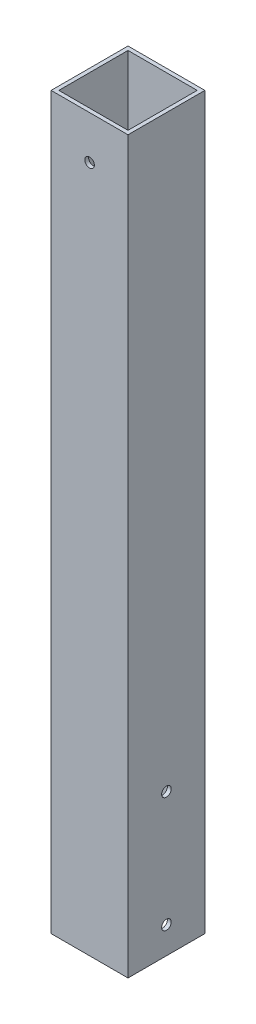
ISO-10303-21;
HEADER;
FILE_DESCRIPTION(('STEP AP214'),'2;1');
FILE_NAME('part.step','',(''),(''),'','','');
FILE_SCHEMA(('AUTOMOTIVE_DESIGN { 1 0 10303 214 1 1 1 1 }'));
ENDSEC;
DATA;
#1=APPLICATION_CONTEXT('core data for automotive mechanical design processes');
#2=APPLICATION_PROTOCOL_DEFINITION('international standard','automotive_design',2000,#1);
#3=PRODUCT_CONTEXT('',#1,'mechanical');
#4=PRODUCT('Part','Part','',(#3));
#5=PRODUCT_RELATED_PRODUCT_CATEGORY('part','',(#4));
#6=PRODUCT_DEFINITION_FORMATION('','',#4);
#7=PRODUCT_DEFINITION_CONTEXT('part definition',#1,'design');
#8=PRODUCT_DEFINITION('design','',#6,#7);
#9=PRODUCT_DEFINITION_SHAPE('','',#8);
#10=(LENGTH_UNIT() NAMED_UNIT(*) SI_UNIT(.MILLI.,.METRE.));
#11=(NAMED_UNIT(*) PLANE_ANGLE_UNIT() SI_UNIT($,.RADIAN.));
#12=(NAMED_UNIT(*) SI_UNIT($,.STERADIAN.) SOLID_ANGLE_UNIT());
#13=UNCERTAINTY_MEASURE_WITH_UNIT(LENGTH_MEASURE(1.E-05),#10,'distance_accuracy_value','');
#14=(GEOMETRIC_REPRESENTATION_CONTEXT(3) GLOBAL_UNCERTAINTY_ASSIGNED_CONTEXT((#13)) GLOBAL_UNIT_ASSIGNED_CONTEXT((#10,
#11,#12)) REPRESENTATION_CONTEXT('',''));
#15=CARTESIAN_POINT('',(0.,0.,0.));
#16=DIRECTION('',(0.,0.,1.));
#17=DIRECTION('',(1.,0.,0.));
#18=AXIS2_PLACEMENT_3D('',#15,#16,#17);
#19=CARTESIAN_POINT('',(0.,380.,0.));
#20=DIRECTION('',(0.,1.,0.));
#21=DIRECTION('',(0.,0.,1.));
#22=AXIS2_PLACEMENT_3D('',#19,#20,#21);
#23=PLANE('',#22);
#24=DIRECTION('',(0.,0.,-1.));
#25=VECTOR('',#24,1.);
#26=CARTESIAN_POINT('',(0.,380.,0.));
#27=LINE('',#26,#25);
#28=CARTESIAN_POINT('',(0.,380.,0.));
#29=VERTEX_POINT('',#28);
#30=CARTESIAN_POINT('',(0.,380.,-40.));
#31=VERTEX_POINT('',#30);
#32=EDGE_CURVE('E168',#29,#31,#27,.T.);
#33=ORIENTED_EDGE('',*,*,#32,.T.);
#34=DIRECTION('',(-1.,0.,0.));
#35=VECTOR('',#34,1.);
#36=CARTESIAN_POINT('',(0.,380.,-40.));
#37=LINE('',#36,#35);
#38=CARTESIAN_POINT('',(-40.,380.,-40.));
#39=VERTEX_POINT('',#38);
#40=EDGE_CURVE('E171',#31,#39,#37,.T.);
#41=ORIENTED_EDGE('',*,*,#40,.T.);
#42=DIRECTION('',(0.,0.,1.));
#43=VECTOR('',#42,1.);
#44=CARTESIAN_POINT('',(-40.,380.,0.));
#45=LINE('',#44,#43);
#46=CARTESIAN_POINT('',(-40.,380.,0.));
#47=VERTEX_POINT('',#46);
#48=EDGE_CURVE('E174',#39,#47,#45,.T.);
#49=ORIENTED_EDGE('',*,*,#48,.T.);
#50=DIRECTION('',(1.,0.,0.));
#51=VECTOR('',#50,1.);
#52=CARTESIAN_POINT('',(0.,380.,0.));
#53=LINE('',#52,#51);
#54=EDGE_CURVE('E176',#47,#29,#53,.T.);
#55=ORIENTED_EDGE('',*,*,#54,.T.);
#56=EDGE_LOOP('',(#33,#41,#49,#55));
#57=FACE_BOUND('',#56,.T.);
#58=DIRECTION('',(-1.,0.,0.));
#59=VECTOR('',#58,1.);
#60=CARTESIAN_POINT('',(0.,380.,-38.));
#61=LINE('',#60,#59);
#62=CARTESIAN_POINT('',(-2.,380.,-38.));
#63=VERTEX_POINT('',#62);
#64=CARTESIAN_POINT('',(-38.,380.,-38.));
#65=VERTEX_POINT('',#64);
#66=EDGE_CURVE('E138',#63,#65,#61,.T.);
#67=ORIENTED_EDGE('',*,*,#66,.F.);
#68=DIRECTION('',(0.,0.,-1.));
#69=VECTOR('',#68,1.);
#70=CARTESIAN_POINT('',(-2.,380.,0.));
#71=LINE('',#70,#69);
#72=CARTESIAN_POINT('',(-2.,380.,-2.));
#73=VERTEX_POINT('',#72);
#74=EDGE_CURVE('E130',#73,#63,#71,.T.);
#75=ORIENTED_EDGE('',*,*,#74,.F.);
#76=DIRECTION('',(1.,0.,0.));
#77=VECTOR('',#76,1.);
#78=CARTESIAN_POINT('',(0.,380.,-2.));
#79=LINE('',#78,#77);
#80=CARTESIAN_POINT('',(-38.,380.,-2.));
#81=VERTEX_POINT('',#80);
#82=EDGE_CURVE('E152',#81,#73,#79,.T.);
#83=ORIENTED_EDGE('',*,*,#82,.F.);
#84=DIRECTION('',(0.,0.,1.));
#85=VECTOR('',#84,1.);
#86=CARTESIAN_POINT('',(-38.,380.,0.));
#87=LINE('',#86,#85);
#88=EDGE_CURVE('E150',#65,#81,#87,.T.);
#89=ORIENTED_EDGE('',*,*,#88,.F.);
#90=EDGE_LOOP('',(#67,#75,#83,#89));
#91=FACE_BOUND('',#90,.T.);
#92=ADVANCED_FACE('F63',(#57,#91),#23,.T.);
#93=CARTESIAN_POINT('',(0.,0.,0.));
#94=DIRECTION('',(0.,1.,0.));
#95=DIRECTION('',(0.,0.,1.));
#96=AXIS2_PLACEMENT_3D('',#93,#94,#95);
#97=PLANE('',#96);
#98=DIRECTION('',(0.,0.,-1.));
#99=VECTOR('',#98,1.);
#100=CARTESIAN_POINT('',(0.,0.,0.));
#101=LINE('',#100,#99);
#102=CARTESIAN_POINT('',(0.,0.,0.));
#103=VERTEX_POINT('',#102);
#104=CARTESIAN_POINT('',(0.,0.,-40.));
#105=VERTEX_POINT('',#104);
#106=EDGE_CURVE('E146',#103,#105,#101,.T.);
#107=ORIENTED_EDGE('',*,*,#106,.F.);
#108=DIRECTION('',(1.,0.,0.));
#109=VECTOR('',#108,1.);
#110=CARTESIAN_POINT('',(0.,0.,0.));
#111=LINE('',#110,#109);
#112=CARTESIAN_POINT('',(-40.,0.,0.));
#113=VERTEX_POINT('',#112);
#114=EDGE_CURVE('E172',#113,#103,#111,.T.);
#115=ORIENTED_EDGE('',*,*,#114,.F.);
#116=DIRECTION('',(0.,0.,1.));
#117=VECTOR('',#116,1.);
#118=CARTESIAN_POINT('',(-40.,0.,0.));
#119=LINE('',#118,#117);
#120=CARTESIAN_POINT('',(-40.,0.,-40.));
#121=VERTEX_POINT('',#120);
#122=EDGE_CURVE('E183',#121,#113,#119,.T.);
#123=ORIENTED_EDGE('',*,*,#122,.F.);
#124=DIRECTION('',(-1.,0.,0.));
#125=VECTOR('',#124,1.);
#126=CARTESIAN_POINT('',(0.,0.,-40.));
#127=LINE('',#126,#125);
#128=EDGE_CURVE('E181',#105,#121,#127,.T.);
#129=ORIENTED_EDGE('',*,*,#128,.F.);
#130=EDGE_LOOP('',(#107,#115,#123,#129));
#131=FACE_BOUND('',#130,.T.);
#132=DIRECTION('',(0.,0.,-1.));
#133=VECTOR('',#132,1.);
#134=CARTESIAN_POINT('',(-2.,0.,0.));
#135=LINE('',#134,#133);
#136=CARTESIAN_POINT('',(-2.,0.,-2.));
#137=VERTEX_POINT('',#136);
#138=CARTESIAN_POINT('',(-2.,0.,-38.));
#139=VERTEX_POINT('',#138);
#140=EDGE_CURVE('E88',#137,#139,#135,.T.);
#141=ORIENTED_EDGE('',*,*,#140,.T.);
#142=DIRECTION('',(-1.,0.,0.));
#143=VECTOR('',#142,1.);
#144=CARTESIAN_POINT('',(0.,0.,-38.));
#145=LINE('',#144,#143);
#146=CARTESIAN_POINT('',(-38.,0.,-38.));
#147=VERTEX_POINT('',#146);
#148=EDGE_CURVE('E145',#139,#147,#145,.T.);
#149=ORIENTED_EDGE('',*,*,#148,.T.);
#150=DIRECTION('',(0.,0.,1.));
#151=VECTOR('',#150,1.);
#152=CARTESIAN_POINT('',(-38.,0.,0.));
#153=LINE('',#152,#151);
#154=CARTESIAN_POINT('',(-38.,0.,-2.));
#155=VERTEX_POINT('',#154);
#156=EDGE_CURVE('E160',#147,#155,#153,.T.);
#157=ORIENTED_EDGE('',*,*,#156,.T.);
#158=DIRECTION('',(1.,0.,0.));
#159=VECTOR('',#158,1.);
#160=CARTESIAN_POINT('',(0.,0.,-2.));
#161=LINE('',#160,#159);
#162=EDGE_CURVE('E139',#155,#137,#161,.T.);
#163=ORIENTED_EDGE('',*,*,#162,.T.);
#164=EDGE_LOOP('',(#141,#149,#157,#163));
#165=FACE_BOUND('',#164,.T.);
#166=ADVANCED_FACE('F249',(#131,#165),#97,.F.);
#167=CARTESIAN_POINT('',(0.,380.,0.));
#168=DIRECTION('',(-1.,0.,0.));
#169=DIRECTION('',(0.,0.,1.));
#170=AXIS2_PLACEMENT_3D('',#167,#168,#169);
#171=PLANE('',#170);
#172=CARTESIAN_POINT('',(0.,14.,-20.));
#173=DIRECTION('',(-1.,0.,0.));
#174=DIRECTION('',(0.,0.,1.));
#175=AXIS2_PLACEMENT_3D('',#172,#173,#174);
#176=CIRCLE('',#175,2.5);
#177=CARTESIAN_POINT('',(0.,14.,-17.5));
#178=VERTEX_POINT('',#177);
#179=EDGE_CURVE('E219',#178,#178,#176,.T.);
#180=ORIENTED_EDGE('',*,*,#179,.T.);
#181=EDGE_LOOP('',(#180));
#182=FACE_BOUND('',#181,.T.);
#183=CARTESIAN_POINT('',(0.,74.,-20.));
#184=DIRECTION('',(-1.,0.,0.));
#185=DIRECTION('',(0.,0.,1.));
#186=AXIS2_PLACEMENT_3D('',#183,#184,#185);
#187=CIRCLE('',#186,2.5);
#188=CARTESIAN_POINT('',(0.,74.,-17.5));
#189=VERTEX_POINT('',#188);
#190=EDGE_CURVE('E204',#189,#189,#187,.T.);
#191=ORIENTED_EDGE('',*,*,#190,.T.);
#192=EDGE_LOOP('',(#191));
#193=FACE_BOUND('',#192,.T.);
#194=ORIENTED_EDGE('',*,*,#106,.T.);
#195=DIRECTION('',(0.,-1.,0.));
#196=VECTOR('',#195,1.);
#197=CARTESIAN_POINT('',(0.,380.,-40.));
#198=LINE('',#197,#196);
#199=EDGE_CURVE('E12',#31,#105,#198,.T.);
#200=ORIENTED_EDGE('',*,*,#199,.F.);
#201=ORIENTED_EDGE('',*,*,#32,.F.);
#202=DIRECTION('',(0.,-1.,0.));
#203=VECTOR('',#202,1.);
#204=CARTESIAN_POINT('',(0.,380.,0.));
#205=LINE('',#204,#203);
#206=EDGE_CURVE('E178',#29,#103,#205,.T.);
#207=ORIENTED_EDGE('',*,*,#206,.T.);
#208=EDGE_LOOP('',(#194,#200,#201,#207));
#209=FACE_BOUND('',#208,.T.);
#210=ADVANCED_FACE('F65',(#182,#193,#209),#171,.F.);
#211=CARTESIAN_POINT('',(0.,380.,-40.));
#212=DIRECTION('',(0.,0.,1.));
#213=DIRECTION('',(1.,0.,0.));
#214=AXIS2_PLACEMENT_3D('',#211,#212,#213);
#215=PLANE('',#214);
#216=CARTESIAN_POINT('',(-20.,357.5,-40.));
#217=DIRECTION('',(0.,0.,1.));
#218=DIRECTION('',(1.,0.,0.));
#219=AXIS2_PLACEMENT_3D('',#216,#217,#218);
#220=CIRCLE('',#219,2.49999999999998);
#221=CARTESIAN_POINT('',(-17.5,357.5,-40.));
#222=VERTEX_POINT('',#221);
#223=EDGE_CURVE('E158',#222,#222,#220,.T.);
#224=ORIENTED_EDGE('',*,*,#223,.T.);
#225=EDGE_LOOP('',(#224));
#226=FACE_BOUND('',#225,.T.);
#227=ORIENTED_EDGE('',*,*,#128,.T.);
#228=DIRECTION('',(0.,-1.,0.));
#229=VECTOR('',#228,1.);
#230=CARTESIAN_POINT('',(-40.,380.,-40.));
#231=LINE('',#230,#229);
#232=EDGE_CURVE('E72',#39,#121,#231,.T.);
#233=ORIENTED_EDGE('',*,*,#232,.F.);
#234=ORIENTED_EDGE('',*,*,#40,.F.);
#235=ORIENTED_EDGE('',*,*,#199,.T.);
#236=EDGE_LOOP('',(#227,#233,#234,#235));
#237=FACE_BOUND('',#236,.T.);
#238=ADVANCED_FACE('F228',(#226,#237),#215,.F.);
#239=CARTESIAN_POINT('',(-40.,380.,0.));
#240=DIRECTION('',(1.,0.,0.));
#241=DIRECTION('',(0.,0.,-1.));
#242=AXIS2_PLACEMENT_3D('',#239,#240,#241);
#243=PLANE('',#242);
#244=CARTESIAN_POINT('',(-40.,14.,-20.));
#245=DIRECTION('',(-1.,0.,0.));
#246=DIRECTION('',(0.,0.,1.));
#247=AXIS2_PLACEMENT_3D('',#244,#245,#246);
#248=CIRCLE('',#247,2.5);
#249=CARTESIAN_POINT('',(-40.,14.,-17.5));
#250=VERTEX_POINT('',#249);
#251=EDGE_CURVE('E200',#250,#250,#248,.T.);
#252=ORIENTED_EDGE('',*,*,#251,.F.);
#253=EDGE_LOOP('',(#252));
#254=FACE_BOUND('',#253,.T.);
#255=CARTESIAN_POINT('',(-40.,74.,-20.));
#256=DIRECTION('',(-1.,0.,0.));
#257=DIRECTION('',(0.,0.,1.));
#258=AXIS2_PLACEMENT_3D('',#255,#256,#257);
#259=CIRCLE('',#258,2.5);
#260=CARTESIAN_POINT('',(-40.,74.,-17.5));
#261=VERTEX_POINT('',#260);
#262=EDGE_CURVE('E207',#261,#261,#259,.T.);
#263=ORIENTED_EDGE('',*,*,#262,.F.);
#264=EDGE_LOOP('',(#263));
#265=FACE_BOUND('',#264,.T.);
#266=ORIENTED_EDGE('',*,*,#122,.T.);
#267=DIRECTION('',(0.,-1.,0.));
#268=VECTOR('',#267,1.);
#269=CARTESIAN_POINT('',(-40.,380.,0.));
#270=LINE('',#269,#268);
#271=EDGE_CURVE('E188',#47,#113,#270,.T.);
#272=ORIENTED_EDGE('',*,*,#271,.F.);
#273=ORIENTED_EDGE('',*,*,#48,.F.);
#274=ORIENTED_EDGE('',*,*,#232,.T.);
#275=EDGE_LOOP('',(#266,#272,#273,#274));
#276=FACE_BOUND('',#275,.T.);
#277=ADVANCED_FACE('F263',(#254,#265,#276),#243,.F.);
#278=CARTESIAN_POINT('',(0.,380.,0.));
#279=DIRECTION('',(0.,0.,-1.));
#280=DIRECTION('',(-1.,0.,0.));
#281=AXIS2_PLACEMENT_3D('',#278,#279,#280);
#282=PLANE('',#281);
#283=CARTESIAN_POINT('',(-20.,357.5,0.));
#284=DIRECTION('',(0.,0.,1.));
#285=DIRECTION('',(1.,0.,0.));
#286=AXIS2_PLACEMENT_3D('',#283,#284,#285);
#287=CIRCLE('',#286,2.49999999999998);
#288=CARTESIAN_POINT('',(-17.5,357.5,0.));
#289=VERTEX_POINT('',#288);
#290=EDGE_CURVE('E196',#289,#289,#287,.T.);
#291=ORIENTED_EDGE('',*,*,#290,.F.);
#292=EDGE_LOOP('',(#291));
#293=FACE_BOUND('',#292,.T.);
#294=ORIENTED_EDGE('',*,*,#114,.T.);
#295=ORIENTED_EDGE('',*,*,#206,.F.);
#296=ORIENTED_EDGE('',*,*,#54,.F.);
#297=ORIENTED_EDGE('',*,*,#271,.T.);
#298=EDGE_LOOP('',(#294,#295,#296,#297));
#299=FACE_BOUND('',#298,.T.);
#300=ADVANCED_FACE('F260',(#293,#299),#282,.F.);
#301=CARTESIAN_POINT('',(-2.,380.,0.));
#302=DIRECTION('',(-1.,0.,0.));
#303=DIRECTION('',(0.,0.,1.));
#304=AXIS2_PLACEMENT_3D('',#301,#302,#303);
#305=PLANE('',#304);
#306=CARTESIAN_POINT('',(-2.,14.,-20.));
#307=DIRECTION('',(-1.,0.,0.));
#308=DIRECTION('',(0.,0.,1.));
#309=AXIS2_PLACEMENT_3D('',#306,#307,#308);
#310=CIRCLE('',#309,2.5);
#311=CARTESIAN_POINT('',(-2.,14.,-17.5));
#312=VERTEX_POINT('',#311);
#313=EDGE_CURVE('E216',#312,#312,#310,.T.);
#314=ORIENTED_EDGE('',*,*,#313,.F.);
#315=EDGE_LOOP('',(#314));
#316=FACE_BOUND('',#315,.T.);
#317=CARTESIAN_POINT('',(-2.,74.,-20.));
#318=DIRECTION('',(-1.,0.,0.));
#319=DIRECTION('',(0.,0.,1.));
#320=AXIS2_PLACEMENT_3D('',#317,#318,#319);
#321=CIRCLE('',#320,2.5);
#322=CARTESIAN_POINT('',(-2.,74.,-17.5));
#323=VERTEX_POINT('',#322);
#324=EDGE_CURVE('E199',#323,#323,#321,.T.);
#325=ORIENTED_EDGE('',*,*,#324,.F.);
#326=EDGE_LOOP('',(#325));
#327=FACE_BOUND('',#326,.T.);
#328=ORIENTED_EDGE('',*,*,#140,.F.);
#329=DIRECTION('',(0.,-1.,0.));
#330=VECTOR('',#329,1.);
#331=CARTESIAN_POINT('',(-2.,380.,-2.));
#332=LINE('',#331,#330);
#333=EDGE_CURVE('E134',#73,#137,#332,.T.);
#334=ORIENTED_EDGE('',*,*,#333,.F.);
#335=ORIENTED_EDGE('',*,*,#74,.T.);
#336=DIRECTION('',(0.,-1.,0.));
#337=VECTOR('',#336,1.);
#338=CARTESIAN_POINT('',(-2.,380.,-38.));
#339=LINE('',#338,#337);
#340=EDGE_CURVE('E133',#63,#139,#339,.T.);
#341=ORIENTED_EDGE('',*,*,#340,.T.);
#342=EDGE_LOOP('',(#328,#334,#335,#341));
#343=FACE_BOUND('',#342,.T.);
#344=ADVANCED_FACE('F132',(#316,#327,#343),#305,.T.);
#345=CARTESIAN_POINT('',(0.,380.,-38.));
#346=DIRECTION('',(0.,0.,1.));
#347=DIRECTION('',(1.,0.,0.));
#348=AXIS2_PLACEMENT_3D('',#345,#346,#347);
#349=PLANE('',#348);
#350=CARTESIAN_POINT('',(-20.,357.5,-38.));
#351=DIRECTION('',(0.,0.,1.));
#352=DIRECTION('',(1.,0.,0.));
#353=AXIS2_PLACEMENT_3D('',#350,#351,#352);
#354=CIRCLE('',#353,2.49999999999998);
#355=CARTESIAN_POINT('',(-17.5,357.5,-38.));
#356=VERTEX_POINT('',#355);
#357=EDGE_CURVE('E195',#356,#356,#354,.T.);
#358=ORIENTED_EDGE('',*,*,#357,.F.);
#359=EDGE_LOOP('',(#358));
#360=FACE_BOUND('',#359,.T.);
#361=ORIENTED_EDGE('',*,*,#148,.F.);
#362=ORIENTED_EDGE('',*,*,#340,.F.);
#363=ORIENTED_EDGE('',*,*,#66,.T.);
#364=DIRECTION('',(0.,-1.,0.));
#365=VECTOR('',#364,1.);
#366=CARTESIAN_POINT('',(-38.,380.,-38.));
#367=LINE('',#366,#365);
#368=EDGE_CURVE('E147',#65,#147,#367,.T.);
#369=ORIENTED_EDGE('',*,*,#368,.T.);
#370=EDGE_LOOP('',(#361,#362,#363,#369));
#371=FACE_BOUND('',#370,.T.);
#372=ADVANCED_FACE('F142',(#360,#371),#349,.T.);
#373=CARTESIAN_POINT('',(-38.,380.,0.));
#374=DIRECTION('',(1.,0.,0.));
#375=DIRECTION('',(0.,0.,-1.));
#376=AXIS2_PLACEMENT_3D('',#373,#374,#375);
#377=PLANE('',#376);
#378=CARTESIAN_POINT('',(-38.,14.,-20.));
#379=DIRECTION('',(1.,0.,0.));
#380=DIRECTION('',(0.,0.,-1.));
#381=AXIS2_PLACEMENT_3D('',#378,#379,#380);
#382=CIRCLE('',#381,2.5);
#383=CARTESIAN_POINT('',(-38.,14.,-22.5));
#384=VERTEX_POINT('',#383);
#385=EDGE_CURVE('E67',#384,#384,#382,.T.);
#386=ORIENTED_EDGE('',*,*,#385,.F.);
#387=EDGE_LOOP('',(#386));
#388=FACE_BOUND('',#387,.T.);
#389=CARTESIAN_POINT('',(-38.,74.,-20.));
#390=DIRECTION('',(1.,0.,0.));
#391=DIRECTION('',(0.,0.,-1.));
#392=AXIS2_PLACEMENT_3D('',#389,#390,#391);
#393=CIRCLE('',#392,2.5);
#394=CARTESIAN_POINT('',(-38.,74.,-22.5));
#395=VERTEX_POINT('',#394);
#396=EDGE_CURVE('E197',#395,#395,#393,.T.);
#397=ORIENTED_EDGE('',*,*,#396,.F.);
#398=EDGE_LOOP('',(#397));
#399=FACE_BOUND('',#398,.T.);
#400=ORIENTED_EDGE('',*,*,#156,.F.);
#401=ORIENTED_EDGE('',*,*,#368,.F.);
#402=ORIENTED_EDGE('',*,*,#88,.T.);
#403=DIRECTION('',(0.,-1.,0.));
#404=VECTOR('',#403,1.);
#405=CARTESIAN_POINT('',(-38.,380.,-2.));
#406=LINE('',#405,#404);
#407=EDGE_CURVE('E80',#81,#155,#406,.T.);
#408=ORIENTED_EDGE('',*,*,#407,.T.);
#409=EDGE_LOOP('',(#400,#401,#402,#408));
#410=FACE_BOUND('',#409,.T.);
#411=ADVANCED_FACE('F292',(#388,#399,#410),#377,.T.);
#412=CARTESIAN_POINT('',(0.,380.,-2.));
#413=DIRECTION('',(0.,0.,-1.));
#414=DIRECTION('',(-1.,0.,0.));
#415=AXIS2_PLACEMENT_3D('',#412,#413,#414);
#416=PLANE('',#415);
#417=CARTESIAN_POINT('',(-20.,357.5,-2.));
#418=DIRECTION('',(0.,0.,-1.));
#419=DIRECTION('',(-1.,0.,0.));
#420=AXIS2_PLACEMENT_3D('',#417,#418,#419);
#421=CIRCLE('',#420,2.49999999999998);
#422=CARTESIAN_POINT('',(-22.5,357.5,-2.));
#423=VERTEX_POINT('',#422);
#424=EDGE_CURVE('E193',#423,#423,#421,.T.);
#425=ORIENTED_EDGE('',*,*,#424,.F.);
#426=EDGE_LOOP('',(#425));
#427=FACE_BOUND('',#426,.T.);
#428=ORIENTED_EDGE('',*,*,#162,.F.);
#429=ORIENTED_EDGE('',*,*,#407,.F.);
#430=ORIENTED_EDGE('',*,*,#82,.T.);
#431=ORIENTED_EDGE('',*,*,#333,.T.);
#432=EDGE_LOOP('',(#428,#429,#430,#431));
#433=FACE_BOUND('',#432,.T.);
#434=ADVANCED_FACE('F245',(#427,#433),#416,.T.);
#435=CARTESIAN_POINT('',(-20.,357.5,-50.));
#436=DIRECTION('',(0.,0.,1.));
#437=DIRECTION('',(1.,0.,0.));
#438=AXIS2_PLACEMENT_3D('',#435,#436,#437);
#439=CYLINDRICAL_SURFACE('',#438,2.49999999999998);
#440=ORIENTED_EDGE('',*,*,#424,.T.);
#441=EDGE_LOOP('',(#440));
#442=FACE_BOUND('',#441,.T.);
#443=ORIENTED_EDGE('',*,*,#290,.T.);
#444=EDGE_LOOP('',(#443));
#445=FACE_BOUND('',#444,.T.);
#446=ADVANCED_FACE('F234',(#442,#445),#439,.F.);
#447=ORIENTED_EDGE('',*,*,#357,.T.);
#448=EDGE_LOOP('',(#447));
#449=FACE_BOUND('',#448,.T.);
#450=ORIENTED_EDGE('',*,*,#223,.F.);
#451=EDGE_LOOP('',(#450));
#452=FACE_BOUND('',#451,.T.);
#453=ADVANCED_FACE('F231',(#449,#452),#439,.F.);
#454=CARTESIAN_POINT('',(10.,74.,-20.));
#455=DIRECTION('',(-1.,0.,0.));
#456=DIRECTION('',(0.,0.,1.));
#457=AXIS2_PLACEMENT_3D('',#454,#455,#456);
#458=CYLINDRICAL_SURFACE('',#457,2.5);
#459=ORIENTED_EDGE('',*,*,#396,.T.);
#460=EDGE_LOOP('',(#459));
#461=FACE_BOUND('',#460,.T.);
#462=ORIENTED_EDGE('',*,*,#262,.T.);
#463=EDGE_LOOP('',(#462));
#464=FACE_BOUND('',#463,.T.);
#465=ADVANCED_FACE('F233',(#461,#464),#458,.F.);
#466=CARTESIAN_POINT('',(10.,14.,-20.));
#467=DIRECTION('',(-1.,0.,0.));
#468=DIRECTION('',(0.,0.,1.));
#469=AXIS2_PLACEMENT_3D('',#466,#467,#468);
#470=CYLINDRICAL_SURFACE('',#469,2.5);
#471=ORIENTED_EDGE('',*,*,#385,.T.);
#472=EDGE_LOOP('',(#471));
#473=FACE_BOUND('',#472,.T.);
#474=ORIENTED_EDGE('',*,*,#251,.T.);
#475=EDGE_LOOP('',(#474));
#476=FACE_BOUND('',#475,.T.);
#477=ADVANCED_FACE('F242',(#473,#476),#470,.F.);
#478=ORIENTED_EDGE('',*,*,#324,.T.);
#479=EDGE_LOOP('',(#478));
#480=FACE_BOUND('',#479,.T.);
#481=ORIENTED_EDGE('',*,*,#190,.F.);
#482=EDGE_LOOP('',(#481));
#483=FACE_BOUND('',#482,.T.);
#484=ADVANCED_FACE('F244',(#480,#483),#458,.F.);
#485=ORIENTED_EDGE('',*,*,#313,.T.);
#486=EDGE_LOOP('',(#485));
#487=FACE_BOUND('',#486,.T.);
#488=ORIENTED_EDGE('',*,*,#179,.F.);
#489=EDGE_LOOP('',(#488));
#490=FACE_BOUND('',#489,.T.);
#491=ADVANCED_FACE('F315',(#487,#490),#470,.F.);
#492=CLOSED_SHELL('',(#92,#166,#210,#238,#277,#300,#344,#372,#411,#434,#446,#453,#465,#477,#484,#491));
#493=MANIFOLD_SOLID_BREP('B2',#492);
#494=ADVANCED_BREP_SHAPE_REPRESENTATION('',(#18,#493),#14);
#495=SHAPE_DEFINITION_REPRESENTATION(#9,#494);
ENDSEC;
END-ISO-10303-21;
